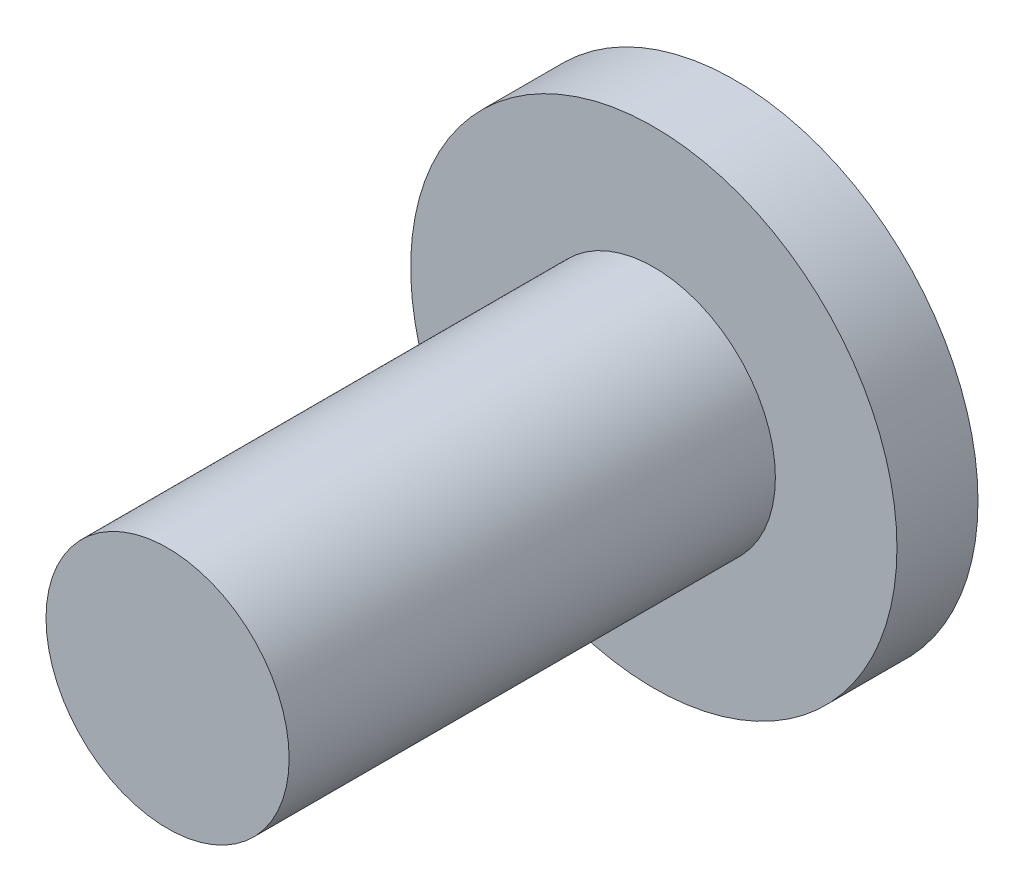
ISO-10303-21;
HEADER;
FILE_DESCRIPTION(('STEP AP214'),'2;1');
FILE_NAME('part.step','',(''),(''),'','','');
FILE_SCHEMA(('AUTOMOTIVE_DESIGN { 1 0 10303 214 1 1 1 1 }'));
ENDSEC;
DATA;
#1=APPLICATION_CONTEXT('core data for automotive mechanical design processes');
#2=APPLICATION_PROTOCOL_DEFINITION('international standard','automotive_design',2000,#1);
#3=PRODUCT_CONTEXT('',#1,'mechanical');
#4=PRODUCT('Part','Part','',(#3));
#5=PRODUCT_RELATED_PRODUCT_CATEGORY('part','',(#4));
#6=PRODUCT_DEFINITION_FORMATION('','',#4);
#7=PRODUCT_DEFINITION_CONTEXT('part definition',#1,'design');
#8=PRODUCT_DEFINITION('design','',#6,#7);
#9=PRODUCT_DEFINITION_SHAPE('','',#8);
#10=(LENGTH_UNIT() NAMED_UNIT(*) SI_UNIT(.MILLI.,.METRE.));
#11=(NAMED_UNIT(*) PLANE_ANGLE_UNIT() SI_UNIT($,.RADIAN.));
#12=(NAMED_UNIT(*) SI_UNIT($,.STERADIAN.) SOLID_ANGLE_UNIT());
#13=UNCERTAINTY_MEASURE_WITH_UNIT(LENGTH_MEASURE(1.E-05),#10,'distance_accuracy_value','');
#14=(GEOMETRIC_REPRESENTATION_CONTEXT(3) GLOBAL_UNCERTAINTY_ASSIGNED_CONTEXT((#13)) GLOBAL_UNIT_ASSIGNED_CONTEXT((#10,
#11,#12)) REPRESENTATION_CONTEXT('',''));
#15=CARTESIAN_POINT('',(0.,0.,0.));
#16=DIRECTION('',(0.,0.,1.));
#17=DIRECTION('',(1.,0.,0.));
#18=AXIS2_PLACEMENT_3D('',#15,#16,#17);
#19=CARTESIAN_POINT('',(0.,0.,1.));
#20=DIRECTION('',(0.,0.,-1.));
#21=DIRECTION('',(-1.,0.,0.));
#22=AXIS2_PLACEMENT_3D('',#19,#20,#21);
#23=CYLINDRICAL_SURFACE('',#22,3.);
#24=CARTESIAN_POINT('',(0.,0.,1.));
#25=DIRECTION('',(0.,0.,1.));
#26=DIRECTION('',(1.,0.,0.));
#27=AXIS2_PLACEMENT_3D('',#24,#25,#26);
#28=CIRCLE('',#27,3.);
#29=CARTESIAN_POINT('',(3.,0.,1.));
#30=VERTEX_POINT('',#29);
#31=EDGE_CURVE('E11',#30,#30,#28,.T.);
#32=ORIENTED_EDGE('',*,*,#31,.F.);
#33=EDGE_LOOP('',(#32));
#34=FACE_BOUND('',#33,.T.);
#35=CARTESIAN_POINT('',(0.,0.,0.));
#36=DIRECTION('',(0.,0.,1.));
#37=DIRECTION('',(1.,0.,0.));
#38=AXIS2_PLACEMENT_3D('',#35,#36,#37);
#39=CIRCLE('',#38,3.);
#40=CARTESIAN_POINT('',(3.,0.,0.));
#41=VERTEX_POINT('',#40);
#42=EDGE_CURVE('E48',#41,#41,#39,.T.);
#43=ORIENTED_EDGE('',*,*,#42,.T.);
#44=EDGE_LOOP('',(#43));
#45=FACE_BOUND('',#44,.T.);
#46=ADVANCED_FACE('F45',(#34,#45),#23,.T.);
#47=CARTESIAN_POINT('',(0.,0.,1.));
#48=DIRECTION('',(0.,0.,1.));
#49=DIRECTION('',(1.,0.,0.));
#50=AXIS2_PLACEMENT_3D('',#47,#48,#49);
#51=PLANE('',#50);
#52=CARTESIAN_POINT('',(0.,0.,1.));
#53=DIRECTION('',(0.,0.,1.));
#54=DIRECTION('',(1.,0.,0.));
#55=AXIS2_PLACEMENT_3D('',#52,#53,#54);
#56=CIRCLE('',#55,1.5);
#57=CARTESIAN_POINT('',(1.5,0.,1.));
#58=VERTEX_POINT('',#57);
#59=EDGE_CURVE('E182',#58,#58,#56,.T.);
#60=ORIENTED_EDGE('',*,*,#59,.F.);
#61=EDGE_LOOP('',(#60));
#62=FACE_BOUND('',#61,.T.);
#63=ORIENTED_EDGE('',*,*,#31,.T.);
#64=EDGE_LOOP('',(#63));
#65=FACE_BOUND('',#64,.T.);
#66=ADVANCED_FACE('F198',(#62,#65),#51,.T.);
#67=CARTESIAN_POINT('',(0.,0.,0.));
#68=DIRECTION('',(0.,0.,1.));
#69=DIRECTION('',(1.,0.,0.));
#70=AXIS2_PLACEMENT_3D('',#67,#68,#69);
#71=PLANE('',#70);
#72=DIRECTION('',(0.5,0.866025403784439,0.));
#73=VECTOR('',#72,1.);
#74=CARTESIAN_POINT('',(-1.15470053837925,0.,0.));
#75=LINE('',#74,#73);
#76=CARTESIAN_POINT('',(-1.15470053837925,0.,0.));
#77=VERTEX_POINT('',#76);
#78=CARTESIAN_POINT('',(-0.577350269189626,1.,0.));
#79=VERTEX_POINT('',#78);
#80=EDGE_CURVE('E138',#77,#79,#75,.T.);
#81=ORIENTED_EDGE('',*,*,#80,.F.);
#82=DIRECTION('',(-0.5,0.866025403784439,0.));
#83=VECTOR('',#82,1.);
#84=CARTESIAN_POINT('',(-0.577350269189626,-1.,0.));
#85=LINE('',#84,#83);
#86=CARTESIAN_POINT('',(-0.577350269189626,-1.,0.));
#87=VERTEX_POINT('',#86);
#88=EDGE_CURVE('E60',#87,#77,#85,.T.);
#89=ORIENTED_EDGE('',*,*,#88,.F.);
#90=DIRECTION('',(-1.,0.,0.));
#91=VECTOR('',#90,1.);
#92=CARTESIAN_POINT('',(0.577350269189626,-1.,0.));
#93=LINE('',#92,#91);
#94=CARTESIAN_POINT('',(0.577350269189626,-1.,0.));
#95=VERTEX_POINT('',#94);
#96=EDGE_CURVE('E152',#95,#87,#93,.T.);
#97=ORIENTED_EDGE('',*,*,#96,.F.);
#98=DIRECTION('',(-0.5,-0.866025403784439,0.));
#99=VECTOR('',#98,1.);
#100=CARTESIAN_POINT('',(1.15470053837925,0.,0.));
#101=LINE('',#100,#99);
#102=CARTESIAN_POINT('',(1.15470053837925,0.,0.));
#103=VERTEX_POINT('',#102);
#104=EDGE_CURVE('E149',#103,#95,#101,.T.);
#105=ORIENTED_EDGE('',*,*,#104,.F.);
#106=DIRECTION('',(0.5,-0.866025403784438,0.));
#107=VECTOR('',#106,1.);
#108=CARTESIAN_POINT('',(0.577350269189626,1.,0.));
#109=LINE('',#108,#107);
#110=CARTESIAN_POINT('',(0.577350269189626,1.,0.));
#111=VERTEX_POINT('',#110);
#112=EDGE_CURVE('E107',#111,#103,#109,.T.);
#113=ORIENTED_EDGE('',*,*,#112,.F.);
#114=DIRECTION('',(1.,0.,0.));
#115=VECTOR('',#114,1.);
#116=CARTESIAN_POINT('',(-0.577350269189626,1.,0.));
#117=LINE('',#116,#115);
#118=EDGE_CURVE('E143',#79,#111,#117,.T.);
#119=ORIENTED_EDGE('',*,*,#118,.F.);
#120=EDGE_LOOP('',(#81,#89,#97,#105,#113,#119));
#121=FACE_BOUND('',#120,.T.);
#122=ORIENTED_EDGE('',*,*,#42,.F.);
#123=EDGE_LOOP('',(#122));
#124=FACE_BOUND('',#123,.T.);
#125=ADVANCED_FACE('F173',(#121,#124),#71,.F.);
#126=CARTESIAN_POINT('',(-0.577350269189626,-1.,1.));
#127=DIRECTION('',(-0.866025403784439,-0.5,0.));
#128=DIRECTION('',(0.5,-0.866025403784439,0.));
#129=AXIS2_PLACEMENT_3D('',#126,#127,#128);
#130=PLANE('',#129);
#131=ORIENTED_EDGE('',*,*,#88,.T.);
#132=DIRECTION('',(0.,0.,-1.));
#133=VECTOR('',#132,1.);
#134=CARTESIAN_POINT('',(-1.15470053837925,0.,1.));
#135=LINE('',#134,#133);
#136=CARTESIAN_POINT('',(-1.15470053837925,0.,1.));
#137=VERTEX_POINT('',#136);
#138=EDGE_CURVE('E91',#137,#77,#135,.T.);
#139=ORIENTED_EDGE('',*,*,#138,.F.);
#140=DIRECTION('',(-0.5,0.866025403784439,0.));
#141=VECTOR('',#140,1.);
#142=CARTESIAN_POINT('',(-0.577350269189626,-1.,1.));
#143=LINE('',#142,#141);
#144=CARTESIAN_POINT('',(-0.577350269189626,-1.,1.));
#145=VERTEX_POINT('',#144);
#146=EDGE_CURVE('E155',#145,#137,#143,.T.);
#147=ORIENTED_EDGE('',*,*,#146,.F.);
#148=DIRECTION('',(0.,0.,-1.));
#149=VECTOR('',#148,1.);
#150=CARTESIAN_POINT('',(-0.577350269189626,-1.,1.));
#151=LINE('',#150,#149);
#152=EDGE_CURVE('E68',#145,#87,#151,.T.);
#153=ORIENTED_EDGE('',*,*,#152,.T.);
#154=EDGE_LOOP('',(#131,#139,#147,#153));
#155=FACE_BOUND('',#154,.T.);
#156=ADVANCED_FACE('F210',(#155),#130,.F.);
#157=CARTESIAN_POINT('',(0.577350269189626,-1.,1.));
#158=DIRECTION('',(0.,-1.,0.));
#159=DIRECTION('',(0.,0.,-1.));
#160=AXIS2_PLACEMENT_3D('',#157,#158,#159);
#161=PLANE('',#160);
#162=ORIENTED_EDGE('',*,*,#96,.T.);
#163=ORIENTED_EDGE('',*,*,#152,.F.);
#164=DIRECTION('',(-1.,0.,0.));
#165=VECTOR('',#164,1.);
#166=CARTESIAN_POINT('',(0.577350269189626,-1.,1.));
#167=LINE('',#166,#165);
#168=CARTESIAN_POINT('',(0.577350269189626,-1.,1.));
#169=VERTEX_POINT('',#168);
#170=EDGE_CURVE('E121',#169,#145,#167,.T.);
#171=ORIENTED_EDGE('',*,*,#170,.F.);
#172=DIRECTION('',(0.,0.,-1.));
#173=VECTOR('',#172,1.);
#174=CARTESIAN_POINT('',(0.577350269189626,-1.,1.));
#175=LINE('',#174,#173);
#176=EDGE_CURVE('E112',#169,#95,#175,.T.);
#177=ORIENTED_EDGE('',*,*,#176,.T.);
#178=EDGE_LOOP('',(#162,#163,#171,#177));
#179=FACE_BOUND('',#178,.T.);
#180=ADVANCED_FACE('F214',(#179),#161,.F.);
#181=CARTESIAN_POINT('',(1.15470053837925,0.,1.));
#182=DIRECTION('',(0.866025403784439,-0.5,0.));
#183=DIRECTION('',(0.5,0.866025403784439,0.));
#184=AXIS2_PLACEMENT_3D('',#181,#182,#183);
#185=PLANE('',#184);
#186=ORIENTED_EDGE('',*,*,#104,.T.);
#187=ORIENTED_EDGE('',*,*,#176,.F.);
#188=DIRECTION('',(-0.5,-0.866025403784439,0.));
#189=VECTOR('',#188,1.);
#190=CARTESIAN_POINT('',(1.15470053837925,0.,1.));
#191=LINE('',#190,#189);
#192=CARTESIAN_POINT('',(1.15470053837925,0.,1.));
#193=VERTEX_POINT('',#192);
#194=EDGE_CURVE('E116',#193,#169,#191,.T.);
#195=ORIENTED_EDGE('',*,*,#194,.F.);
#196=DIRECTION('',(0.,0.,-1.));
#197=VECTOR('',#196,1.);
#198=CARTESIAN_POINT('',(1.15470053837925,0.,1.));
#199=LINE('',#198,#197);
#200=EDGE_CURVE('E100',#193,#103,#199,.T.);
#201=ORIENTED_EDGE('',*,*,#200,.T.);
#202=EDGE_LOOP('',(#186,#187,#195,#201));
#203=FACE_BOUND('',#202,.T.);
#204=ADVANCED_FACE('F117',(#203),#185,.F.);
#205=CARTESIAN_POINT('',(0.577350269189626,1.,1.));
#206=DIRECTION('',(0.866025403784439,0.5,0.));
#207=DIRECTION('',(-0.5,0.866025403784438,0.));
#208=AXIS2_PLACEMENT_3D('',#205,#206,#207);
#209=PLANE('',#208);
#210=ORIENTED_EDGE('',*,*,#112,.T.);
#211=ORIENTED_EDGE('',*,*,#200,.F.);
#212=DIRECTION('',(0.5,-0.866025403784438,0.));
#213=VECTOR('',#212,1.);
#214=CARTESIAN_POINT('',(0.577350269189626,1.,1.));
#215=LINE('',#214,#213);
#216=CARTESIAN_POINT('',(0.577350269189626,1.,1.));
#217=VERTEX_POINT('',#216);
#218=EDGE_CURVE('E104',#217,#193,#215,.T.);
#219=ORIENTED_EDGE('',*,*,#218,.F.);
#220=DIRECTION('',(0.,0.,-1.));
#221=VECTOR('',#220,1.);
#222=CARTESIAN_POINT('',(0.577350269189626,1.,1.));
#223=LINE('',#222,#221);
#224=EDGE_CURVE('E113',#217,#111,#223,.T.);
#225=ORIENTED_EDGE('',*,*,#224,.T.);
#226=EDGE_LOOP('',(#210,#211,#219,#225));
#227=FACE_BOUND('',#226,.T.);
#228=ADVANCED_FACE('F102',(#227),#209,.F.);
#229=CARTESIAN_POINT('',(-0.577350269189626,1.,1.));
#230=DIRECTION('',(0.,1.,0.));
#231=DIRECTION('',(-1.,0.,0.));
#232=AXIS2_PLACEMENT_3D('',#229,#230,#231);
#233=PLANE('',#232);
#234=ORIENTED_EDGE('',*,*,#118,.T.);
#235=ORIENTED_EDGE('',*,*,#224,.F.);
#236=DIRECTION('',(1.,0.,0.));
#237=VECTOR('',#236,1.);
#238=CARTESIAN_POINT('',(-0.577350269189626,1.,1.));
#239=LINE('',#238,#237);
#240=CARTESIAN_POINT('',(-0.577350269189626,1.,1.));
#241=VERTEX_POINT('',#240);
#242=EDGE_CURVE('E126',#241,#217,#239,.T.);
#243=ORIENTED_EDGE('',*,*,#242,.F.);
#244=DIRECTION('',(0.,0.,-1.));
#245=VECTOR('',#244,1.);
#246=CARTESIAN_POINT('',(-0.577350269189626,1.,1.));
#247=LINE('',#246,#245);
#248=EDGE_CURVE('E162',#241,#79,#247,.T.);
#249=ORIENTED_EDGE('',*,*,#248,.T.);
#250=EDGE_LOOP('',(#234,#235,#243,#249));
#251=FACE_BOUND('',#250,.T.);
#252=ADVANCED_FACE('F177',(#251),#233,.F.);
#253=CARTESIAN_POINT('',(-1.15470053837925,0.,1.));
#254=DIRECTION('',(-0.866025403784439,0.5,0.));
#255=DIRECTION('',(-0.5,-0.866025403784439,0.));
#256=AXIS2_PLACEMENT_3D('',#253,#254,#255);
#257=PLANE('',#256);
#258=ORIENTED_EDGE('',*,*,#80,.T.);
#259=ORIENTED_EDGE('',*,*,#248,.F.);
#260=DIRECTION('',(0.5,0.866025403784439,0.));
#261=VECTOR('',#260,1.);
#262=CARTESIAN_POINT('',(-1.15470053837925,0.,1.));
#263=LINE('',#262,#261);
#264=EDGE_CURVE('E130',#137,#241,#263,.T.);
#265=ORIENTED_EDGE('',*,*,#264,.F.);
#266=ORIENTED_EDGE('',*,*,#138,.T.);
#267=EDGE_LOOP('',(#258,#259,#265,#266));
#268=FACE_BOUND('',#267,.T.);
#269=ADVANCED_FACE('F168',(#268),#257,.F.);
#270=CARTESIAN_POINT('',(0.,0.,1.));
#271=DIRECTION('',(0.,0.,1.));
#272=DIRECTION('',(1.,0.,0.));
#273=AXIS2_PLACEMENT_3D('',#270,#271,#272);
#274=PLANE('',#273);
#275=ORIENTED_EDGE('',*,*,#170,.T.);
#276=ORIENTED_EDGE('',*,*,#146,.T.);
#277=ORIENTED_EDGE('',*,*,#264,.T.);
#278=ORIENTED_EDGE('',*,*,#242,.T.);
#279=ORIENTED_EDGE('',*,*,#218,.T.);
#280=ORIENTED_EDGE('',*,*,#194,.T.);
#281=EDGE_LOOP('',(#275,#276,#277,#278,#279,#280));
#282=FACE_BOUND('',#281,.T.);
#283=ADVANCED_FACE('F123',(#282),#274,.F.);
#284=CARTESIAN_POINT('',(0.,0.,7.));
#285=DIRECTION('',(0.,0.,-1.));
#286=DIRECTION('',(-1.,0.,0.));
#287=AXIS2_PLACEMENT_3D('',#284,#285,#286);
#288=CYLINDRICAL_SURFACE('',#287,1.5);
#289=CARTESIAN_POINT('',(0.,0.,7.));
#290=DIRECTION('',(0.,0.,1.));
#291=DIRECTION('',(1.,0.,0.));
#292=AXIS2_PLACEMENT_3D('',#289,#290,#291);
#293=CIRCLE('',#292,1.5);
#294=CARTESIAN_POINT('',(1.5,0.,7.));
#295=VERTEX_POINT('',#294);
#296=EDGE_CURVE('E139',#295,#295,#293,.T.);
#297=ORIENTED_EDGE('',*,*,#296,.F.);
#298=EDGE_LOOP('',(#297));
#299=FACE_BOUND('',#298,.T.);
#300=ORIENTED_EDGE('',*,*,#59,.T.);
#301=EDGE_LOOP('',(#300));
#302=FACE_BOUND('',#301,.T.);
#303=ADVANCED_FACE('F192',(#299,#302),#288,.T.);
#304=CARTESIAN_POINT('',(0.,0.,7.));
#305=DIRECTION('',(0.,0.,1.));
#306=DIRECTION('',(1.,0.,0.));
#307=AXIS2_PLACEMENT_3D('',#304,#305,#306);
#308=PLANE('',#307);
#309=ORIENTED_EDGE('',*,*,#296,.T.);
#310=EDGE_LOOP('',(#309));
#311=FACE_BOUND('',#310,.T.);
#312=ADVANCED_FACE('F190',(#311),#308,.T.);
#313=CLOSED_SHELL('',(#46,#66,#125,#156,#180,#204,#228,#252,#269,#283,#303,#312));
#314=MANIFOLD_SOLID_BREP('B2',#313);
#315=ADVANCED_BREP_SHAPE_REPRESENTATION('',(#18,#314),#14);
#316=SHAPE_DEFINITION_REPRESENTATION(#9,#315);
ENDSEC;
END-ISO-10303-21;
